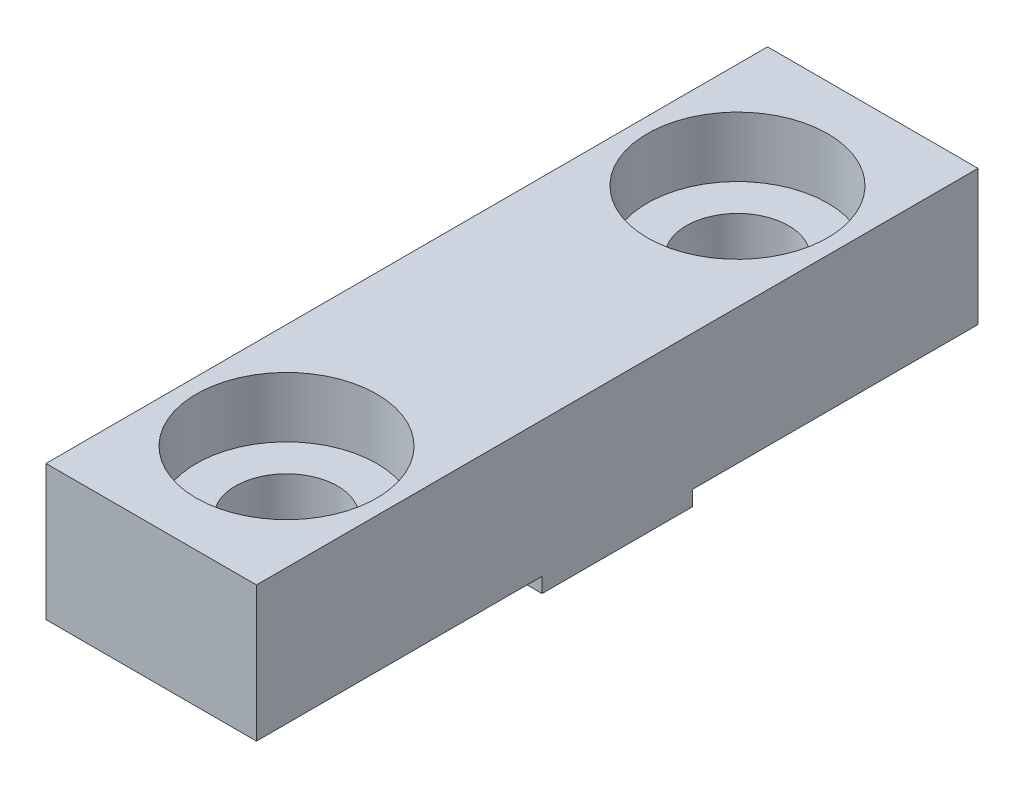
ISO-10303-21;
HEADER;
FILE_DESCRIPTION(('STEP AP214'),'2;1');
FILE_NAME('part.step','',(''),(''),'','','');
FILE_SCHEMA(('AUTOMOTIVE_DESIGN { 1 0 10303 214 1 1 1 1 }'));
ENDSEC;
DATA;
#1=APPLICATION_CONTEXT('core data for automotive mechanical design processes');
#2=APPLICATION_PROTOCOL_DEFINITION('international standard','automotive_design',2000,#1);
#3=PRODUCT_CONTEXT('',#1,'mechanical');
#4=PRODUCT('Part','Part','',(#3));
#5=PRODUCT_RELATED_PRODUCT_CATEGORY('part','',(#4));
#6=PRODUCT_DEFINITION_FORMATION('','',#4);
#7=PRODUCT_DEFINITION_CONTEXT('part definition',#1,'design');
#8=PRODUCT_DEFINITION('design','',#6,#7);
#9=PRODUCT_DEFINITION_SHAPE('','',#8);
#10=(LENGTH_UNIT() NAMED_UNIT(*) SI_UNIT(.MILLI.,.METRE.));
#11=(NAMED_UNIT(*) PLANE_ANGLE_UNIT() SI_UNIT($,.RADIAN.));
#12=(NAMED_UNIT(*) SI_UNIT($,.STERADIAN.) SOLID_ANGLE_UNIT());
#13=UNCERTAINTY_MEASURE_WITH_UNIT(LENGTH_MEASURE(1.E-05),#10,'distance_accuracy_value','');
#14=(GEOMETRIC_REPRESENTATION_CONTEXT(3) GLOBAL_UNCERTAINTY_ASSIGNED_CONTEXT((#13)) GLOBAL_UNIT_ASSIGNED_CONTEXT((#10,
#11,#12)) REPRESENTATION_CONTEXT('',''));
#15=CARTESIAN_POINT('',(0.,0.,0.));
#16=DIRECTION('',(0.,0.,1.));
#17=DIRECTION('',(1.,0.,0.));
#18=AXIS2_PLACEMENT_3D('',#15,#16,#17);
#19=CARTESIAN_POINT('',(-51.5,5.5,7.5));
#20=DIRECTION('',(0.,1.,0.));
#21=DIRECTION('',(0.,0.,1.));
#22=AXIS2_PLACEMENT_3D('',#19,#20,#21);
#23=CYLINDRICAL_SURFACE('',#22,1.7);
#24=CARTESIAN_POINT('',(-51.5,6.,7.5));
#25=DIRECTION('',(0.,-1.,0.));
#26=DIRECTION('',(0.,0.,-1.));
#27=AXIS2_PLACEMENT_3D('',#24,#25,#26);
#28=CIRCLE('',#27,1.7);
#29=CARTESIAN_POINT('',(-51.5,6.,5.8));
#30=VERTEX_POINT('',#29);
#31=EDGE_CURVE('E179',#30,#30,#28,.T.);
#32=ORIENTED_EDGE('',*,*,#31,.T.);
#33=EDGE_LOOP('',(#32));
#34=FACE_BOUND('',#33,.T.);
#35=CARTESIAN_POINT('',(-51.5,8.5,7.5));
#36=DIRECTION('',(0.,1.,0.));
#37=DIRECTION('',(0.,0.,1.));
#38=AXIS2_PLACEMENT_3D('',#35,#36,#37);
#39=CIRCLE('',#38,1.7);
#40=CARTESIAN_POINT('',(-51.5,8.5,9.2));
#41=VERTEX_POINT('',#40);
#42=EDGE_CURVE('E43',#41,#41,#39,.F.);
#43=ORIENTED_EDGE('',*,*,#42,.F.);
#44=EDGE_LOOP('',(#43));
#45=FACE_BOUND('',#44,.T.);
#46=ADVANCED_FACE('F39',(#34,#45),#23,.F.);
#47=CARTESIAN_POINT('',(-51.5,5.5,-7.5));
#48=DIRECTION('',(0.,1.,0.));
#49=DIRECTION('',(0.,0.,1.));
#50=AXIS2_PLACEMENT_3D('',#47,#48,#49);
#51=CYLINDRICAL_SURFACE('',#50,1.7);
#52=CARTESIAN_POINT('',(-51.5,6.,-7.5));
#53=DIRECTION('',(0.,-1.,0.));
#54=DIRECTION('',(0.,0.,-1.));
#55=AXIS2_PLACEMENT_3D('',#52,#53,#54);
#56=CIRCLE('',#55,1.7);
#57=CARTESIAN_POINT('',(-51.5,6.,-9.2));
#58=VERTEX_POINT('',#57);
#59=EDGE_CURVE('E142',#58,#58,#56,.T.);
#60=ORIENTED_EDGE('',*,*,#59,.T.);
#61=EDGE_LOOP('',(#60));
#62=FACE_BOUND('',#61,.T.);
#63=CARTESIAN_POINT('',(-51.5,8.5,-7.5));
#64=DIRECTION('',(0.,1.,0.));
#65=DIRECTION('',(0.,0.,1.));
#66=AXIS2_PLACEMENT_3D('',#63,#64,#65);
#67=CIRCLE('',#66,1.7);
#68=CARTESIAN_POINT('',(-51.5,8.5,-5.8));
#69=VERTEX_POINT('',#68);
#70=EDGE_CURVE('E173',#69,#69,#67,.F.);
#71=ORIENTED_EDGE('',*,*,#70,.F.);
#72=EDGE_LOOP('',(#71));
#73=FACE_BOUND('',#72,.T.);
#74=ADVANCED_FACE('F199',(#62,#73),#51,.F.);
#75=CARTESIAN_POINT('',(0.,6.,0.));
#76=DIRECTION('',(0.,-1.,0.));
#77=DIRECTION('',(0.,0.,-1.));
#78=AXIS2_PLACEMENT_3D('',#75,#76,#77);
#79=PLANE('',#78);
#80=ORIENTED_EDGE('',*,*,#31,.F.);
#81=EDGE_LOOP('',(#80));
#82=FACE_BOUND('',#81,.T.);
#83=DIRECTION('',(0.,0.,1.));
#84=VECTOR('',#83,1.);
#85=CARTESIAN_POINT('',(-55.,6.,12.));
#86=LINE('',#85,#84);
#87=CARTESIAN_POINT('',(-55.,6.,2.5));
#88=VERTEX_POINT('',#87);
#89=CARTESIAN_POINT('',(-55.,6.,12.));
#90=VERTEX_POINT('',#89);
#91=EDGE_CURVE('E149',#88,#90,#86,.T.);
#92=ORIENTED_EDGE('',*,*,#91,.F.);
#93=DIRECTION('',(1.,0.,0.));
#94=VECTOR('',#93,1.);
#95=CARTESIAN_POINT('',(-48.,6.,2.5));
#96=LINE('',#95,#94);
#97=CARTESIAN_POINT('',(-48.,6.,2.5));
#98=VERTEX_POINT('',#97);
#99=EDGE_CURVE('E121',#88,#98,#96,.T.);
#100=ORIENTED_EDGE('',*,*,#99,.T.);
#101=DIRECTION('',(0.,0.,-1.));
#102=VECTOR('',#101,1.);
#103=CARTESIAN_POINT('',(-48.,6.,-12.));
#104=LINE('',#103,#102);
#105=CARTESIAN_POINT('',(-48.,6.,12.));
#106=VERTEX_POINT('',#105);
#107=EDGE_CURVE('E165',#106,#98,#104,.T.);
#108=ORIENTED_EDGE('',*,*,#107,.F.);
#109=DIRECTION('',(1.,0.,0.));
#110=VECTOR('',#109,1.);
#111=CARTESIAN_POINT('',(-48.,6.,12.));
#112=LINE('',#111,#110);
#113=EDGE_CURVE('E162',#90,#106,#112,.T.);
#114=ORIENTED_EDGE('',*,*,#113,.F.);
#115=EDGE_LOOP('',(#92,#100,#108,#114));
#116=FACE_BOUND('',#115,.T.);
#117=ADVANCED_FACE('F205',(#82,#116),#79,.T.);
#118=ORIENTED_EDGE('',*,*,#59,.F.);
#119=EDGE_LOOP('',(#118));
#120=FACE_BOUND('',#119,.T.);
#121=CARTESIAN_POINT('',(-48.,6.,-2.5));
#122=VERTEX_POINT('',#121);
#123=CARTESIAN_POINT('',(-48.,6.,-12.));
#124=VERTEX_POINT('',#123);
#125=EDGE_CURVE('E164',#122,#124,#104,.T.);
#126=ORIENTED_EDGE('',*,*,#125,.F.);
#127=DIRECTION('',(-1.,0.,0.));
#128=VECTOR('',#127,1.);
#129=CARTESIAN_POINT('',(-55.,6.,-2.5));
#130=LINE('',#129,#128);
#131=CARTESIAN_POINT('',(-55.,6.,-2.5));
#132=VERTEX_POINT('',#131);
#133=EDGE_CURVE('E138',#122,#132,#130,.T.);
#134=ORIENTED_EDGE('',*,*,#133,.T.);
#135=CARTESIAN_POINT('',(-55.,6.,-12.));
#136=VERTEX_POINT('',#135);
#137=EDGE_CURVE('E160',#136,#132,#86,.T.);
#138=ORIENTED_EDGE('',*,*,#137,.F.);
#139=DIRECTION('',(-1.,0.,0.));
#140=VECTOR('',#139,1.);
#141=CARTESIAN_POINT('',(-55.,6.,-12.));
#142=LINE('',#141,#140);
#143=EDGE_CURVE('E86',#124,#136,#142,.T.);
#144=ORIENTED_EDGE('',*,*,#143,.F.);
#145=EDGE_LOOP('',(#126,#134,#138,#144));
#146=FACE_BOUND('',#145,.T.);
#147=ADVANCED_FACE('F202',(#120,#146),#79,.T.);
#148=CARTESIAN_POINT('',(-55.,10.5,12.));
#149=DIRECTION('',(1.,0.,0.));
#150=DIRECTION('',(0.,0.,-1.));
#151=AXIS2_PLACEMENT_3D('',#148,#149,#150);
#152=PLANE('',#151);
#153=ORIENTED_EDGE('',*,*,#137,.T.);
#154=DIRECTION('',(0.,1.,0.));
#155=VECTOR('',#154,1.);
#156=CARTESIAN_POINT('',(-55.,5.5,-2.5));
#157=LINE('',#156,#155);
#158=CARTESIAN_POINT('',(-55.,5.5,-2.5));
#159=VERTEX_POINT('',#158);
#160=EDGE_CURVE('E56',#159,#132,#157,.T.);
#161=ORIENTED_EDGE('',*,*,#160,.F.);
#162=DIRECTION('',(0.,0.,1.));
#163=VECTOR('',#162,1.);
#164=CARTESIAN_POINT('',(-55.,5.5,2.5));
#165=LINE('',#164,#163);
#166=CARTESIAN_POINT('',(-55.,5.5,2.5));
#167=VERTEX_POINT('',#166);
#168=EDGE_CURVE('E133',#159,#167,#165,.T.);
#169=ORIENTED_EDGE('',*,*,#168,.T.);
#170=DIRECTION('',(0.,1.,0.));
#171=VECTOR('',#170,1.);
#172=CARTESIAN_POINT('',(-55.,5.5,2.5));
#173=LINE('',#172,#171);
#174=EDGE_CURVE('E116',#167,#88,#173,.T.);
#175=ORIENTED_EDGE('',*,*,#174,.T.);
#176=ORIENTED_EDGE('',*,*,#91,.T.);
#177=DIRECTION('',(0.,-1.,0.));
#178=VECTOR('',#177,1.);
#179=CARTESIAN_POINT('',(-55.,10.5,12.));
#180=LINE('',#179,#178);
#181=CARTESIAN_POINT('',(-55.,10.5,12.));
#182=VERTEX_POINT('',#181);
#183=EDGE_CURVE('E11',#182,#90,#180,.T.);
#184=ORIENTED_EDGE('',*,*,#183,.F.);
#185=DIRECTION('',(0.,0.,1.));
#186=VECTOR('',#185,1.);
#187=CARTESIAN_POINT('',(-55.,10.5,12.));
#188=LINE('',#187,#186);
#189=CARTESIAN_POINT('',(-55.,10.5,-12.));
#190=VERTEX_POINT('',#189);
#191=EDGE_CURVE('E153',#190,#182,#188,.T.);
#192=ORIENTED_EDGE('',*,*,#191,.F.);
#193=DIRECTION('',(0.,-1.,0.));
#194=VECTOR('',#193,1.);
#195=CARTESIAN_POINT('',(-55.,10.5,-12.));
#196=LINE('',#195,#194);
#197=EDGE_CURVE('E159',#190,#136,#196,.T.);
#198=ORIENTED_EDGE('',*,*,#197,.T.);
#199=EDGE_LOOP('',(#153,#161,#169,#175,#176,#184,#192,#198));
#200=FACE_BOUND('',#199,.T.);
#201=ADVANCED_FACE('F41',(#200),#152,.F.);
#202=CARTESIAN_POINT('',(-48.,10.5,12.));
#203=DIRECTION('',(0.,0.,-1.));
#204=DIRECTION('',(-1.,0.,0.));
#205=AXIS2_PLACEMENT_3D('',#202,#203,#204);
#206=PLANE('',#205);
#207=ORIENTED_EDGE('',*,*,#113,.T.);
#208=DIRECTION('',(0.,-1.,0.));
#209=VECTOR('',#208,1.);
#210=CARTESIAN_POINT('',(-48.,10.5,12.));
#211=LINE('',#210,#209);
#212=CARTESIAN_POINT('',(-48.,10.5,12.));
#213=VERTEX_POINT('',#212);
#214=EDGE_CURVE('E48',#213,#106,#211,.T.);
#215=ORIENTED_EDGE('',*,*,#214,.F.);
#216=DIRECTION('',(1.,0.,0.));
#217=VECTOR('',#216,1.);
#218=CARTESIAN_POINT('',(-48.,10.5,12.));
#219=LINE('',#218,#217);
#220=EDGE_CURVE('E93',#182,#213,#219,.T.);
#221=ORIENTED_EDGE('',*,*,#220,.F.);
#222=ORIENTED_EDGE('',*,*,#183,.T.);
#223=EDGE_LOOP('',(#207,#215,#221,#222));
#224=FACE_BOUND('',#223,.T.);
#225=ADVANCED_FACE('F217',(#224),#206,.F.);
#226=CARTESIAN_POINT('',(-48.,10.5,-12.));
#227=DIRECTION('',(-1.,0.,0.));
#228=DIRECTION('',(0.,0.,1.));
#229=AXIS2_PLACEMENT_3D('',#226,#227,#228);
#230=PLANE('',#229);
#231=ORIENTED_EDGE('',*,*,#107,.T.);
#232=DIRECTION('',(0.,1.,0.));
#233=VECTOR('',#232,1.);
#234=CARTESIAN_POINT('',(-48.,5.5,2.5));
#235=LINE('',#234,#233);
#236=CARTESIAN_POINT('',(-48.,5.5,2.5));
#237=VERTEX_POINT('',#236);
#238=EDGE_CURVE('E125',#237,#98,#235,.T.);
#239=ORIENTED_EDGE('',*,*,#238,.F.);
#240=DIRECTION('',(0.,0.,-1.));
#241=VECTOR('',#240,1.);
#242=CARTESIAN_POINT('',(-48.,5.5,-2.5));
#243=LINE('',#242,#241);
#244=CARTESIAN_POINT('',(-48.,5.5,-2.5));
#245=VERTEX_POINT('',#244);
#246=EDGE_CURVE('E135',#237,#245,#243,.T.);
#247=ORIENTED_EDGE('',*,*,#246,.T.);
#248=DIRECTION('',(0.,1.,0.));
#249=VECTOR('',#248,1.);
#250=CARTESIAN_POINT('',(-48.,5.5,-2.5));
#251=LINE('',#250,#249);
#252=EDGE_CURVE('E150',#245,#122,#251,.T.);
#253=ORIENTED_EDGE('',*,*,#252,.T.);
#254=ORIENTED_EDGE('',*,*,#125,.T.);
#255=DIRECTION('',(0.,-1.,0.));
#256=VECTOR('',#255,1.);
#257=CARTESIAN_POINT('',(-48.,10.5,-12.));
#258=LINE('',#257,#256);
#259=CARTESIAN_POINT('',(-48.,10.5,-12.));
#260=VERTEX_POINT('',#259);
#261=EDGE_CURVE('E170',#260,#124,#258,.T.);
#262=ORIENTED_EDGE('',*,*,#261,.F.);
#263=DIRECTION('',(0.,0.,-1.));
#264=VECTOR('',#263,1.);
#265=CARTESIAN_POINT('',(-48.,10.5,-12.));
#266=LINE('',#265,#264);
#267=EDGE_CURVE('E156',#213,#260,#266,.T.);
#268=ORIENTED_EDGE('',*,*,#267,.F.);
#269=ORIENTED_EDGE('',*,*,#214,.T.);
#270=EDGE_LOOP('',(#231,#239,#247,#253,#254,#262,#268,#269));
#271=FACE_BOUND('',#270,.T.);
#272=ADVANCED_FACE('F211',(#271),#230,.F.);
#273=CARTESIAN_POINT('',(-55.,10.5,-12.));
#274=DIRECTION('',(0.,0.,1.));
#275=DIRECTION('',(1.,0.,0.));
#276=AXIS2_PLACEMENT_3D('',#273,#274,#275);
#277=PLANE('',#276);
#278=ORIENTED_EDGE('',*,*,#143,.T.);
#279=ORIENTED_EDGE('',*,*,#197,.F.);
#280=DIRECTION('',(-1.,0.,0.));
#281=VECTOR('',#280,1.);
#282=CARTESIAN_POINT('',(-55.,10.5,-12.));
#283=LINE('',#282,#281);
#284=EDGE_CURVE('E65',#260,#190,#283,.T.);
#285=ORIENTED_EDGE('',*,*,#284,.F.);
#286=ORIENTED_EDGE('',*,*,#261,.T.);
#287=EDGE_LOOP('',(#278,#279,#285,#286));
#288=FACE_BOUND('',#287,.T.);
#289=ADVANCED_FACE('F213',(#288),#277,.F.);
#290=CARTESIAN_POINT('',(0.,10.5,0.));
#291=DIRECTION('',(0.,-1.,0.));
#292=DIRECTION('',(0.,0.,-1.));
#293=AXIS2_PLACEMENT_3D('',#290,#291,#292);
#294=PLANE('',#293);
#295=CARTESIAN_POINT('',(-51.5,10.5,-7.5));
#296=DIRECTION('',(0.,1.,0.));
#297=DIRECTION('',(0.,0.,1.));
#298=AXIS2_PLACEMENT_3D('',#295,#296,#297);
#299=CIRCLE('',#298,3.);
#300=CARTESIAN_POINT('',(-51.5,10.5,-4.5));
#301=VERTEX_POINT('',#300);
#302=EDGE_CURVE('E181',#301,#301,#299,.T.);
#303=ORIENTED_EDGE('',*,*,#302,.F.);
#304=EDGE_LOOP('',(#303));
#305=FACE_BOUND('',#304,.T.);
#306=CARTESIAN_POINT('',(-51.5,10.5,7.5));
#307=DIRECTION('',(0.,1.,0.));
#308=DIRECTION('',(0.,0.,1.));
#309=AXIS2_PLACEMENT_3D('',#306,#307,#308);
#310=CIRCLE('',#309,3.);
#311=CARTESIAN_POINT('',(-51.5,10.5,10.5));
#312=VERTEX_POINT('',#311);
#313=EDGE_CURVE('E186',#312,#312,#310,.T.);
#314=ORIENTED_EDGE('',*,*,#313,.F.);
#315=EDGE_LOOP('',(#314));
#316=FACE_BOUND('',#315,.T.);
#317=ORIENTED_EDGE('',*,*,#191,.T.);
#318=ORIENTED_EDGE('',*,*,#220,.T.);
#319=ORIENTED_EDGE('',*,*,#267,.T.);
#320=ORIENTED_EDGE('',*,*,#284,.T.);
#321=EDGE_LOOP('',(#317,#318,#319,#320));
#322=FACE_BOUND('',#321,.T.);
#323=ADVANCED_FACE('F216',(#305,#316,#322),#294,.F.);
#324=CARTESIAN_POINT('',(-55.,5.5,-2.5));
#325=DIRECTION('',(0.,0.,-1.));
#326=DIRECTION('',(-1.,0.,0.));
#327=AXIS2_PLACEMENT_3D('',#324,#325,#326);
#328=PLANE('',#327);
#329=ORIENTED_EDGE('',*,*,#133,.F.);
#330=ORIENTED_EDGE('',*,*,#252,.F.);
#331=DIRECTION('',(-1.,0.,0.));
#332=VECTOR('',#331,1.);
#333=CARTESIAN_POINT('',(-55.,5.5,-2.5));
#334=LINE('',#333,#332);
#335=EDGE_CURVE('E126',#245,#159,#334,.T.);
#336=ORIENTED_EDGE('',*,*,#335,.T.);
#337=ORIENTED_EDGE('',*,*,#160,.T.);
#338=EDGE_LOOP('',(#329,#330,#336,#337));
#339=FACE_BOUND('',#338,.T.);
#340=ADVANCED_FACE('F239',(#339),#328,.T.);
#341=CARTESIAN_POINT('',(-48.,5.5,2.5));
#342=DIRECTION('',(0.,0.,1.));
#343=DIRECTION('',(1.,0.,0.));
#344=AXIS2_PLACEMENT_3D('',#341,#342,#343);
#345=PLANE('',#344);
#346=ORIENTED_EDGE('',*,*,#99,.F.);
#347=ORIENTED_EDGE('',*,*,#174,.F.);
#348=DIRECTION('',(1.,0.,0.));
#349=VECTOR('',#348,1.);
#350=CARTESIAN_POINT('',(-48.,5.5,2.5));
#351=LINE('',#350,#349);
#352=EDGE_CURVE('E119',#167,#237,#351,.T.);
#353=ORIENTED_EDGE('',*,*,#352,.T.);
#354=ORIENTED_EDGE('',*,*,#238,.T.);
#355=EDGE_LOOP('',(#346,#347,#353,#354));
#356=FACE_BOUND('',#355,.T.);
#357=ADVANCED_FACE('F118',(#356),#345,.T.);
#358=CARTESIAN_POINT('',(0.,5.5,0.));
#359=DIRECTION('',(0.,-1.,0.));
#360=DIRECTION('',(0.,0.,-1.));
#361=AXIS2_PLACEMENT_3D('',#358,#359,#360);
#362=PLANE('',#361);
#363=ORIENTED_EDGE('',*,*,#168,.F.);
#364=ORIENTED_EDGE('',*,*,#335,.F.);
#365=ORIENTED_EDGE('',*,*,#246,.F.);
#366=ORIENTED_EDGE('',*,*,#352,.F.);
#367=EDGE_LOOP('',(#363,#364,#365,#366));
#368=FACE_BOUND('',#367,.T.);
#369=ADVANCED_FACE('F131',(#368),#362,.T.);
#370=CARTESIAN_POINT('',(-51.5,8.5,-7.5));
#371=DIRECTION('',(0.,1.,0.));
#372=DIRECTION('',(0.,0.,1.));
#373=AXIS2_PLACEMENT_3D('',#370,#371,#372);
#374=PLANE('',#373);
#375=CARTESIAN_POINT('',(-51.5,8.5,-7.5));
#376=DIRECTION('',(0.,1.,0.));
#377=DIRECTION('',(0.,0.,1.));
#378=AXIS2_PLACEMENT_3D('',#375,#376,#377);
#379=CIRCLE('',#378,3.);
#380=CARTESIAN_POINT('',(-51.5,8.5,-4.5));
#381=VERTEX_POINT('',#380);
#382=EDGE_CURVE('E175',#381,#381,#379,.T.);
#383=ORIENTED_EDGE('',*,*,#382,.T.);
#384=EDGE_LOOP('',(#383));
#385=FACE_BOUND('',#384,.T.);
#386=ORIENTED_EDGE('',*,*,#70,.T.);
#387=EDGE_LOOP('',(#386));
#388=FACE_BOUND('',#387,.T.);
#389=ADVANCED_FACE('F238',(#385,#388),#374,.T.);
#390=CARTESIAN_POINT('',(-51.5,8.5,-7.5));
#391=DIRECTION('',(0.,1.,0.));
#392=DIRECTION('',(0.,0.,1.));
#393=AXIS2_PLACEMENT_3D('',#390,#391,#392);
#394=CYLINDRICAL_SURFACE('',#393,3.);
#395=ORIENTED_EDGE('',*,*,#382,.F.);
#396=EDGE_LOOP('',(#395));
#397=FACE_BOUND('',#396,.T.);
#398=ORIENTED_EDGE('',*,*,#302,.T.);
#399=EDGE_LOOP('',(#398));
#400=FACE_BOUND('',#399,.T.);
#401=ADVANCED_FACE('F261',(#397,#400),#394,.F.);
#402=CARTESIAN_POINT('',(-51.5,8.5,7.5));
#403=DIRECTION('',(0.,1.,0.));
#404=DIRECTION('',(0.,0.,1.));
#405=AXIS2_PLACEMENT_3D('',#402,#403,#404);
#406=PLANE('',#405);
#407=CARTESIAN_POINT('',(-51.5,8.5,7.5));
#408=DIRECTION('',(0.,1.,0.));
#409=DIRECTION('',(0.,0.,1.));
#410=AXIS2_PLACEMENT_3D('',#407,#408,#409);
#411=CIRCLE('',#410,3.);
#412=CARTESIAN_POINT('',(-51.5,8.5,10.5));
#413=VERTEX_POINT('',#412);
#414=EDGE_CURVE('E191',#413,#413,#411,.T.);
#415=ORIENTED_EDGE('',*,*,#414,.T.);
#416=EDGE_LOOP('',(#415));
#417=FACE_BOUND('',#416,.T.);
#418=ORIENTED_EDGE('',*,*,#42,.T.);
#419=EDGE_LOOP('',(#418));
#420=FACE_BOUND('',#419,.T.);
#421=ADVANCED_FACE('F255',(#417,#420),#406,.T.);
#422=CARTESIAN_POINT('',(-51.5,8.5,7.5));
#423=DIRECTION('',(0.,1.,0.));
#424=DIRECTION('',(0.,0.,1.));
#425=AXIS2_PLACEMENT_3D('',#422,#423,#424);
#426=CYLINDRICAL_SURFACE('',#425,3.);
#427=ORIENTED_EDGE('',*,*,#414,.F.);
#428=EDGE_LOOP('',(#427));
#429=FACE_BOUND('',#428,.T.);
#430=ORIENTED_EDGE('',*,*,#313,.T.);
#431=EDGE_LOOP('',(#430));
#432=FACE_BOUND('',#431,.T.);
#433=ADVANCED_FACE('F253',(#429,#432),#426,.F.);
#434=CLOSED_SHELL('',(#46,#74,#117,#147,#201,#225,#272,#289,#323,#340,#357,#369,#389,#401,#421,#433));
#435=MANIFOLD_SOLID_BREP('B2',#434);
#436=ADVANCED_BREP_SHAPE_REPRESENTATION('',(#18,#435),#14);
#437=SHAPE_DEFINITION_REPRESENTATION(#9,#436);
ENDSEC;
END-ISO-10303-21;
